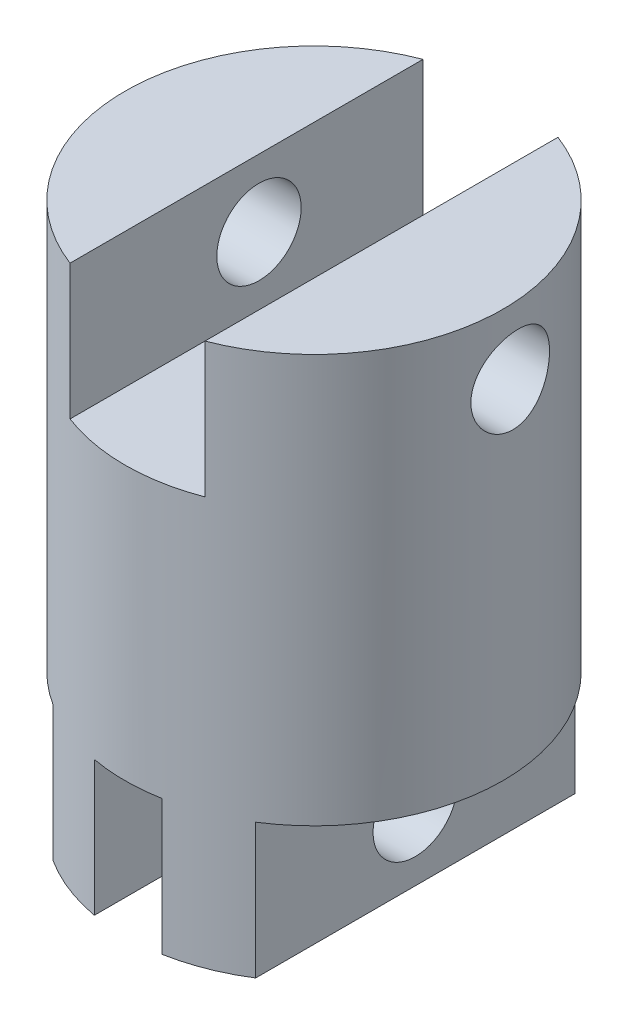
ISO-10303-21;
HEADER;
FILE_DESCRIPTION(('STEP AP214'),'2;1');
FILE_NAME('part.step','',(''),(''),'','','');
FILE_SCHEMA(('AUTOMOTIVE_DESIGN { 1 0 10303 214 1 1 1 1 }'));
ENDSEC;
DATA;
#1=APPLICATION_CONTEXT('core data for automotive mechanical design processes');
#2=APPLICATION_PROTOCOL_DEFINITION('international standard','automotive_design',2000,#1);
#3=PRODUCT_CONTEXT('',#1,'mechanical');
#4=PRODUCT('Part','Part','',(#3));
#5=PRODUCT_RELATED_PRODUCT_CATEGORY('part','',(#4));
#6=PRODUCT_DEFINITION_FORMATION('','',#4);
#7=PRODUCT_DEFINITION_CONTEXT('part definition',#1,'design');
#8=PRODUCT_DEFINITION('design','',#6,#7);
#9=PRODUCT_DEFINITION_SHAPE('','',#8);
#10=(LENGTH_UNIT() NAMED_UNIT(*) SI_UNIT(.MILLI.,.METRE.));
#11=(NAMED_UNIT(*) PLANE_ANGLE_UNIT() SI_UNIT($,.RADIAN.));
#12=(NAMED_UNIT(*) SI_UNIT($,.STERADIAN.) SOLID_ANGLE_UNIT());
#13=UNCERTAINTY_MEASURE_WITH_UNIT(LENGTH_MEASURE(1.E-05),#10,'distance_accuracy_value','');
#14=(GEOMETRIC_REPRESENTATION_CONTEXT(3) GLOBAL_UNCERTAINTY_ASSIGNED_CONTEXT((#13)) GLOBAL_UNIT_ASSIGNED_CONTEXT((#10,
#11,#12)) REPRESENTATION_CONTEXT('',''));
#15=CARTESIAN_POINT('',(0.,0.,0.));
#16=DIRECTION('',(0.,0.,1.));
#17=DIRECTION('',(1.,0.,0.));
#18=AXIS2_PLACEMENT_3D('',#15,#16,#17);
#19=CARTESIAN_POINT('',(0.,10.16,0.));
#20=DIRECTION('',(0.,-1.,0.));
#21=DIRECTION('',(0.,0.,-1.));
#22=AXIS2_PLACEMENT_3D('',#19,#20,#21);
#23=PLANE('',#22);
#24=CARTESIAN_POINT('',(0.,10.16,0.));
#25=DIRECTION('',(0.,-1.,0.));
#26=DIRECTION('',(0.,0.,-1.));
#27=AXIS2_PLACEMENT_3D('',#24,#25,#26);
#28=CIRCLE('',#27,2.54);
#29=CARTESIAN_POINT('',(2.54,10.16,0.));
#30=VERTEX_POINT('',#29);
#31=CARTESIAN_POINT('',(-2.54,10.16,0.));
#32=VERTEX_POINT('',#31);
#33=EDGE_CURVE('E57',#30,#32,#28,.T.);
#34=ORIENTED_EDGE('',*,*,#33,.F.);
#35=DIRECTION('',(0.,0.,1.));
#36=VECTOR('',#35,1.);
#37=CARTESIAN_POINT('',(2.54,10.16,13.9953769509792));
#38=LINE('',#37,#36);
#39=CARTESIAN_POINT('',(2.54,10.16,13.9953769509792));
#40=VERTEX_POINT('',#39);
#41=EDGE_CURVE('E148',#30,#40,#38,.T.);
#42=ORIENTED_EDGE('',*,*,#41,.T.);
#43=CARTESIAN_POINT('',(0.,10.16,0.));
#44=DIRECTION('',(0.,-1.,0.));
#45=DIRECTION('',(0.,0.,-1.));
#46=AXIS2_PLACEMENT_3D('',#43,#44,#45);
#47=CIRCLE('',#46,14.224);
#48=CARTESIAN_POINT('',(-2.54,10.16,13.9953769509792));
#49=VERTEX_POINT('',#48);
#50=EDGE_CURVE('E180',#40,#49,#47,.T.);
#51=ORIENTED_EDGE('',*,*,#50,.T.);
#52=DIRECTION('',(0.,0.,-1.));
#53=VECTOR('',#52,1.);
#54=CARTESIAN_POINT('',(-2.54,10.16,13.9953769509792));
#55=LINE('',#54,#53);
#56=EDGE_CURVE('E150',#49,#32,#55,.T.);
#57=ORIENTED_EDGE('',*,*,#56,.T.);
#58=EDGE_LOOP('',(#34,#42,#51,#57));
#59=FACE_BOUND('',#58,.T.);
#60=ADVANCED_FACE('F39',(#59),#23,.T.);
#61=CARTESIAN_POINT('',(0.,0.,0.));
#62=DIRECTION('',(0.,1.,0.));
#63=DIRECTION('',(0.,0.,1.));
#64=AXIS2_PLACEMENT_3D('',#61,#62,#63);
#65=PLANE('',#64);
#66=CARTESIAN_POINT('',(0.,0.,0.));
#67=DIRECTION('',(0.,1.,0.));
#68=DIRECTION('',(0.,0.,1.));
#69=AXIS2_PLACEMENT_3D('',#66,#67,#68);
#70=CIRCLE('',#69,14.224);
#71=CARTESIAN_POINT('',(7.62,0.,-12.0107358642175));
#72=VERTEX_POINT('',#71);
#73=CARTESIAN_POINT('',(2.54,0.,-13.9953769509792));
#74=VERTEX_POINT('',#73);
#75=EDGE_CURVE('E228',#72,#74,#70,.T.);
#76=ORIENTED_EDGE('',*,*,#75,.F.);
#77=DIRECTION('',(0.,0.,-1.));
#78=VECTOR('',#77,1.);
#79=CARTESIAN_POINT('',(7.62,0.,12.0107358642175));
#80=LINE('',#79,#78);
#81=CARTESIAN_POINT('',(7.62,0.,12.0107358642175));
#82=VERTEX_POINT('',#81);
#83=EDGE_CURVE('E462',#82,#72,#80,.T.);
#84=ORIENTED_EDGE('',*,*,#83,.F.);
#85=CARTESIAN_POINT('',(2.54,0.,13.9953769509792));
#86=VERTEX_POINT('',#85);
#87=EDGE_CURVE('E225',#86,#82,#70,.T.);
#88=ORIENTED_EDGE('',*,*,#87,.F.);
#89=DIRECTION('',(0.,0.,1.));
#90=VECTOR('',#89,1.);
#91=CARTESIAN_POINT('',(2.54,0.,13.9953769509792));
#92=LINE('',#91,#90);
#93=EDGE_CURVE('E176',#74,#86,#92,.T.);
#94=ORIENTED_EDGE('',*,*,#93,.F.);
#95=EDGE_LOOP('',(#76,#84,#88,#94));
#96=FACE_BOUND('',#95,.T.);
#97=ADVANCED_FACE('F321',(#96),#65,.F.);
#98=CARTESIAN_POINT('',(0.,40.894,0.));
#99=DIRECTION('',(0.,1.,0.));
#100=DIRECTION('',(0.,0.,1.));
#101=AXIS2_PLACEMENT_3D('',#98,#99,#100);
#102=PLANE('',#101);
#103=DIRECTION('',(0.,0.,-1.));
#104=VECTOR('',#103,1.);
#105=CARTESIAN_POINT('',(5.08,40.894,-13.285923979912));
#106=LINE('',#105,#104);
#107=CARTESIAN_POINT('',(5.08,40.894,13.285923979912));
#108=VERTEX_POINT('',#107);
#109=CARTESIAN_POINT('',(5.08,40.894,-13.285923979912));
#110=VERTEX_POINT('',#109);
#111=EDGE_CURVE('E195',#108,#110,#106,.T.);
#112=ORIENTED_EDGE('',*,*,#111,.F.);
#113=CARTESIAN_POINT('',(0.,40.894,0.));
#114=DIRECTION('',(0.,1.,0.));
#115=DIRECTION('',(0.,0.,1.));
#116=AXIS2_PLACEMENT_3D('',#113,#114,#115);
#117=CIRCLE('',#116,14.224);
#118=EDGE_CURVE('E11',#108,#110,#117,.T.);
#119=ORIENTED_EDGE('',*,*,#118,.T.);
#120=EDGE_LOOP('',(#112,#119));
#121=FACE_BOUND('',#120,.T.);
#122=ADVANCED_FACE('F318',(#121),#102,.T.);
#123=CARTESIAN_POINT('',(0.,40.894,0.));
#124=DIRECTION('',(0.,-1.,0.));
#125=DIRECTION('',(0.,0.,-1.));
#126=AXIS2_PLACEMENT_3D('',#123,#124,#125);
#127=CYLINDRICAL_SURFACE('',#126,14.224);
#128=CARTESIAN_POINT('',(-13.6163424476978,35.814,-4.11307602008802));
#129=CARTESIAN_POINT('',(-13.6163464933495,35.9879350319566,-4.11306992670584));
#130=CARTESIAN_POINT('',(-13.6207012560097,36.1619398649119,-4.09873000577014));
#131=CARTESIAN_POINT('',(-13.6376814645094,36.5049361335148,-4.0418642853371));
#132=CARTESIAN_POINT('',(-13.6503128734136,36.6739238626683,-3.99931816389405));
#133=CARTESIAN_POINT('',(-13.6825482114407,37.0018171755543,-3.8875956182581));
#134=CARTESIAN_POINT('',(-13.7021409077868,37.1607385185224,-3.81846208096061));
#135=CARTESIAN_POINT('',(-13.7464534742163,37.464690401487,-3.65571817194117));
#136=CARTESIAN_POINT('',(-13.7711735180498,37.6097204705069,-3.56210697071751));
#137=CARTESIAN_POINT('',(-13.824240361603,37.8858770872154,-3.35033418445522));
#138=CARTESIAN_POINT('',(-13.8526632977985,38.0165572294538,-3.23160970388735));
#139=CARTESIAN_POINT('',(-13.9101855998359,38.2564369352111,-2.97426856472494));
#140=CARTESIAN_POINT('',(-13.9392850764497,38.3656329529807,-2.83564862909394));
#141=CARTESIAN_POINT('',(-13.9965686122876,38.562327946645,-2.53806485718074));
#142=CARTESIAN_POINT('',(-14.0247073807823,38.6491686037583,-2.3786561130963));
#143=CARTESIAN_POINT('',(-14.0769627448023,38.7946242058183,-2.0468201507846));
#144=CARTESIAN_POINT('',(-14.1010796258335,38.8532411548687,-1.87439385791106));
#145=CARTESIAN_POINT('',(-14.1432686636008,38.9397315999161,-1.52347291043426));
#146=CARTESIAN_POINT('',(-14.1614092641535,38.9679622495235,-1.34507475053602));
#147=CARTESIAN_POINT('',(-14.1909623897953,38.9937547756175,-0.985531523676964));
#148=CARTESIAN_POINT('',(-14.2023761483574,38.991322276511,-0.804386966563939));
#149=CARTESIAN_POINT('',(-14.2179653062774,38.9561437085153,-0.449773442348153));
#150=CARTESIAN_POINT('',(-14.2223299205258,38.9242275388267,-0.276229975171825));
#151=CARTESIAN_POINT('',(-14.2248725764363,38.8321054416451,0.0632180014334298));
#152=CARTESIAN_POINT('',(-14.223050791663,38.7719003078634,0.229122725041301));
#153=CARTESIAN_POINT('',(-14.2143435449891,38.6253911163474,0.547606213839148));
#154=CARTESIAN_POINT('',(-14.207488444832,38.5392453664967,0.700258770691743));
#155=CARTESIAN_POINT('',(-14.1902999607818,38.3431642944539,0.989213835118324));
#156=CARTESIAN_POINT('',(-14.1799662502137,38.2332267383284,1.12551480548964));
#157=CARTESIAN_POINT('',(-14.157470951252,37.9906604029071,1.3801511419533));
#158=CARTESIAN_POINT('',(-14.1452831546706,37.8577017319725,1.49816999759197));
#159=CARTESIAN_POINT('',(-14.121192063088,37.5739604630996,1.71042514435716));
#160=CARTESIAN_POINT('',(-14.1092887845153,37.4231768388907,1.80466006514492));
#161=CARTESIAN_POINT('',(-14.0875096151677,37.1063680590371,1.96750976689973));
#162=CARTESIAN_POINT('',(-14.0776542065242,36.9402109069447,2.03587085582092));
#163=CARTESIAN_POINT('',(-14.0616458914782,36.5985956397679,2.14366189945061));
#164=CARTESIAN_POINT('',(-14.0554927112565,36.4231382135822,2.18309399381349));
#165=CARTESIAN_POINT('',(-14.0478723710926,36.069549446712,2.2316058746665));
#166=CARTESIAN_POINT('',(-14.0463644662888,35.8914552042461,2.24094960668048));
#167=CARTESIAN_POINT('',(-14.0481483994063,35.5362403275426,2.22973836374366));
#168=CARTESIAN_POINT('',(-14.0514400520778,35.3591196559925,2.20918454275631));
#169=CARTESIAN_POINT('',(-14.0622822171874,35.0121964929364,2.13907080008077));
#170=CARTESIAN_POINT('',(-14.0698018492552,34.8423504416273,2.08972110043227));
#171=CARTESIAN_POINT('',(-14.0879506423554,34.513325173616,1.96363290046471));
#172=CARTESIAN_POINT('',(-14.0985800179637,34.3541466939207,1.88689251007483));
#173=CARTESIAN_POINT('',(-14.1214452420732,34.0494416529346,1.70739161860209));
#174=CARTESIAN_POINT('',(-14.1336943530067,33.9040469599664,1.60440897635785));
#175=CARTESIAN_POINT('',(-14.157793801623,33.6324638133882,1.37559136045164));
#176=CARTESIAN_POINT('',(-14.1696441166975,33.5062764472478,1.24975509375998));
#177=CARTESIAN_POINT('',(-14.1910224427971,33.2757573860532,0.977641763561387));
#178=CARTESIAN_POINT('',(-14.2005327079564,33.1715934961499,0.831220984583768));
#179=CARTESIAN_POINT('',(-14.2152276327244,32.9893477299338,0.522761394106219));
#180=CARTESIAN_POINT('',(-14.2204127014247,32.9112633873489,0.360724061289926));
#181=CARTESIAN_POINT('',(-14.2249359053719,32.7842557209876,0.0276712745096149));
#182=CARTESIAN_POINT('',(-14.2243412255017,32.7350043586767,-0.14321810013157));
#183=CARTESIAN_POINT('',(-14.2165957706335,32.6656955897076,-0.490664215536213));
#184=CARTESIAN_POINT('',(-14.2094456855096,32.6456351116502,-0.667220358056892));
#185=CARTESIAN_POINT('',(-14.1885799172968,32.6352276266175,-1.01826236191764));
#186=CARTESIAN_POINT('',(-14.174959625613,32.6444596416994,-1.19274170616162));
#187=CARTESIAN_POINT('',(-14.141744146279,32.6912105000451,-1.53727505151267));
#188=CARTESIAN_POINT('',(-14.1221486556033,32.7287307780584,-1.70732882770723));
#189=CARTESIAN_POINT('',(-14.0779537946186,32.8312404734396,-2.04006076174768));
#190=CARTESIAN_POINT('',(-14.0533081328417,32.8964904843329,-2.20265230317249));
#191=CARTESIAN_POINT('',(-14.0008681927008,33.0525135343595,-2.51453909755992));
#192=CARTESIAN_POINT('',(-13.9730734134006,33.1432906375504,-2.66383222835268));
#193=CARTESIAN_POINT('',(-13.9156541980413,33.3507755899329,-2.94933025977667));
#194=CARTESIAN_POINT('',(-13.8860004160196,33.4681314302752,-3.08505871719465));
#195=CARTESIAN_POINT('',(-13.828095747917,33.724204911788,-3.33503301391553));
#196=CARTESIAN_POINT('',(-13.7998452096893,33.8629278150817,-3.44927354589455));
#197=CARTESIAN_POINT('',(-13.7470641678874,34.1595614172533,-3.65399959382471));
#198=CARTESIAN_POINT('',(-13.7225712418819,34.3176406644855,-3.74425102969636));
#199=CARTESIAN_POINT('',(-13.6800919910017,34.6475347757128,-3.8966096308186));
#200=CARTESIAN_POINT('',(-13.6620992266002,34.8193358386597,-3.95874466569694));
#201=CARTESIAN_POINT('',(-13.63787777829,35.1285302145908,-4.04126295275682));
#202=CARTESIAN_POINT('',(-13.6298496510107,35.2640869409034,-4.06813523028456));
#203=CARTESIAN_POINT('',(-13.6190806037134,35.5377479121654,-4.10404342599839));
#204=CARTESIAN_POINT('',(-13.6163392344352,35.6758519396424,-4.11308085976248));
#205=CARTESIAN_POINT('',(-13.6163424476978,35.814,-4.11307602008802));
#206=B_SPLINE_CURVE_WITH_KNOTS('',3,(#128,#129,#130,#131,#132,#133,#134,#135,#136,#137,#138,
#139,#140,#141,#142,#143,#144,#145,#146,#147,#148,#149,#150,#151,#152,#153,#154,#155,#156,#157,
#158,#159,#160,#161,#162,#163,#164,#165,#166,#167,#168,#169,#170,#171,#172,#173,#174,#175,#176,
#177,#178,#179,#180,#181,#182,#183,#184,#185,#186,#187,#188,#189,#190,#191,#192,#193,#194,#195,
#196,#197,#198,#199,#200,#201,#202,#203,#204,#205),.UNSPECIFIED.,.T.,.F.,(4,2,2,2,2,2,2,2,2,2,2,
2,2,2,2,2,2,2,2,2,2,2,2,2,2,2,2,2,2,2,2,2,2,2,2,2,2,2,4),(0.,0.521292414316557,1.04296081708785,
1.56379124709196,2.084639329342,2.61870932242577,3.1528673848531,3.70131003100702,
4.24971372770369,4.79159875885824,5.33338439586698,5.86036992801959,6.38734067527686,
6.91115849954563,7.43502552908346,7.96713736897425,8.49927986010553,9.03651256444963,
9.57370552983112,10.1061730294661,10.6386199778627,11.1672276279472,11.6958717611977,
12.2291488280213,12.7624560764039,13.2996909825271,13.8368750694073,14.3678223653898,
14.8987137922532,15.4220102383416,15.9453332272339,16.4736869186285,17.0021247745935,
17.5451842275619,18.0883776356926,18.6366915011972,19.1844606683088,19.598532840324,
20.012569823598),.UNSPECIFIED.);
#207=CARTESIAN_POINT('',(-13.6163424476978,35.814,-4.11307602008802));
#208=VERTEX_POINT('',#207);
#209=EDGE_CURVE('E261',#208,#208,#206,.T.);
#210=ORIENTED_EDGE('',*,*,#209,.T.);
#211=EDGE_LOOP('',(#210));
#212=FACE_BOUND('',#211,.T.);
#213=CARTESIAN_POINT('',(13.6163424476978,35.814,-4.11307602008802));
#214=CARTESIAN_POINT('',(13.6163464933495,35.6400649680434,-4.11306992670584));
#215=CARTESIAN_POINT('',(13.6207012560097,35.4660601350881,-4.09873000577014));
#216=CARTESIAN_POINT('',(13.6376814645094,35.1230638664852,-4.0418642853371));
#217=CARTESIAN_POINT('',(13.6503128734136,34.9540761373317,-3.99931816389405));
#218=CARTESIAN_POINT('',(13.6825482114407,34.6261828244457,-3.8875956182581));
#219=CARTESIAN_POINT('',(13.7021409077868,34.4672614814776,-3.81846208096061));
#220=CARTESIAN_POINT('',(13.7464534742163,34.163309598513,-3.65571817194117));
#221=CARTESIAN_POINT('',(13.7711735180498,34.0182795294931,-3.56210697071751));
#222=CARTESIAN_POINT('',(13.824240361603,33.7421229127846,-3.35033418445522));
#223=CARTESIAN_POINT('',(13.8526632977985,33.6114427705462,-3.23160970388735));
#224=CARTESIAN_POINT('',(13.9101855998359,33.3715630647889,-2.97426856472494));
#225=CARTESIAN_POINT('',(13.9392850764497,33.2623670470193,-2.83564862909394));
#226=CARTESIAN_POINT('',(13.9965686122876,33.065672053355,-2.53806485718074));
#227=CARTESIAN_POINT('',(14.0247073807823,32.9788313962417,-2.3786561130963));
#228=CARTESIAN_POINT('',(14.0769627448023,32.8333757941817,-2.0468201507846));
#229=CARTESIAN_POINT('',(14.1010796258335,32.7747588451313,-1.87439385791106));
#230=CARTESIAN_POINT('',(14.1432686636008,32.6882684000839,-1.52347291043426));
#231=CARTESIAN_POINT('',(14.1614092641535,32.6600377504765,-1.34507475053602));
#232=CARTESIAN_POINT('',(14.1909623897953,32.6342452243825,-0.985531523676964));
#233=CARTESIAN_POINT('',(14.2023761483574,32.636677723489,-0.804386966563939));
#234=CARTESIAN_POINT('',(14.2179653062774,32.6718562914847,-0.449773442348153));
#235=CARTESIAN_POINT('',(14.2223299205258,32.7037724611733,-0.276229975171825));
#236=CARTESIAN_POINT('',(14.2248725764363,32.7958945583549,0.0632180014334298));
#237=CARTESIAN_POINT('',(14.223050791663,32.8560996921366,0.229122725041301));
#238=CARTESIAN_POINT('',(14.2143435449891,33.0026088836526,0.547606213839148));
#239=CARTESIAN_POINT('',(14.207488444832,33.0887546335033,0.700258770691743));
#240=CARTESIAN_POINT('',(14.1902999607818,33.2848357055461,0.989213835118324));
#241=CARTESIAN_POINT('',(14.1799662502137,33.3947732616716,1.12551480548964));
#242=CARTESIAN_POINT('',(14.157470951252,33.6373395970929,1.3801511419533));
#243=CARTESIAN_POINT('',(14.1452831546706,33.7702982680275,1.49816999759197));
#244=CARTESIAN_POINT('',(14.121192063088,34.0540395369004,1.71042514435716));
#245=CARTESIAN_POINT('',(14.1092887845153,34.2048231611093,1.80466006514492));
#246=CARTESIAN_POINT('',(14.0875096151677,34.5216319409629,1.96750976689973));
#247=CARTESIAN_POINT('',(14.0776542065242,34.6877890930553,2.03587085582092));
#248=CARTESIAN_POINT('',(14.0616458914782,35.0294043602321,2.14366189945061));
#249=CARTESIAN_POINT('',(14.0554927112565,35.2048617864178,2.18309399381349));
#250=CARTESIAN_POINT('',(14.0478723710926,35.558450553288,2.2316058746665));
#251=CARTESIAN_POINT('',(14.0463644662888,35.7365447957539,2.24094960668048));
#252=CARTESIAN_POINT('',(14.0481483994063,36.0917596724574,2.22973836374366));
#253=CARTESIAN_POINT('',(14.0514400520778,36.2688803440075,2.20918454275631));
#254=CARTESIAN_POINT('',(14.0622822171874,36.6158035070636,2.13907080008077));
#255=CARTESIAN_POINT('',(14.0698018492552,36.7856495583727,2.08972110043227));
#256=CARTESIAN_POINT('',(14.0879506423554,37.114674826384,1.96363290046471));
#257=CARTESIAN_POINT('',(14.0985800179637,37.2738533060792,1.88689251007483));
#258=CARTESIAN_POINT('',(14.1214452420732,37.5785583470654,1.70739161860209));
#259=CARTESIAN_POINT('',(14.1336943530067,37.7239530400336,1.60440897635785));
#260=CARTESIAN_POINT('',(14.157793801623,37.9955361866118,1.37559136045164));
#261=CARTESIAN_POINT('',(14.1696441166975,38.1217235527522,1.24975509375998));
#262=CARTESIAN_POINT('',(14.1910224427971,38.3522426139468,0.977641763561388));
#263=CARTESIAN_POINT('',(14.2005327079564,38.4564065038501,0.831220984583771));
#264=CARTESIAN_POINT('',(14.2152276327244,38.6386522700662,0.522761394106221));
#265=CARTESIAN_POINT('',(14.2204127014247,38.7167366126511,0.360724061289927));
#266=CARTESIAN_POINT('',(14.2249359053719,38.8437442790124,0.0276712745096142));
#267=CARTESIAN_POINT('',(14.2243412255017,38.8929956413233,-0.143218100131571));
#268=CARTESIAN_POINT('',(14.2165957706335,38.9623044102924,-0.490664215536214));
#269=CARTESIAN_POINT('',(14.2094456855096,38.9823648883498,-0.667220358056892));
#270=CARTESIAN_POINT('',(14.1885799172968,38.9927723733825,-1.01826236191764));
#271=CARTESIAN_POINT('',(14.174959625613,38.9835403583005,-1.19274170616162));
#272=CARTESIAN_POINT('',(14.141744146279,38.9367894999549,-1.53727505151267));
#273=CARTESIAN_POINT('',(14.1221486556033,38.8992692219416,-1.70732882770723));
#274=CARTESIAN_POINT('',(14.0779537946186,38.7967595265604,-2.04006076174768));
#275=CARTESIAN_POINT('',(14.0533081328417,38.7315095156671,-2.20265230317249));
#276=CARTESIAN_POINT('',(14.0008681927008,38.5754864656405,-2.51453909755992));
#277=CARTESIAN_POINT('',(13.9730734134006,38.4847093624496,-2.66383222835268));
#278=CARTESIAN_POINT('',(13.9156541980413,38.2772244100671,-2.94933025977667));
#279=CARTESIAN_POINT('',(13.8860004160196,38.1598685697248,-3.08505871719466));
#280=CARTESIAN_POINT('',(13.828095747917,37.903795088212,-3.33503301391553));
#281=CARTESIAN_POINT('',(13.7998452096893,37.7650721849183,-3.44927354589455));
#282=CARTESIAN_POINT('',(13.7470641678874,37.4684385827467,-3.65399959382471));
#283=CARTESIAN_POINT('',(13.7225712418819,37.3103593355145,-3.74425102969636));
#284=CARTESIAN_POINT('',(13.6800919910017,36.9804652242872,-3.8966096308186));
#285=CARTESIAN_POINT('',(13.6620992266002,36.8086641613403,-3.95874466569694));
#286=CARTESIAN_POINT('',(13.63787777829,36.4994697854092,-4.04126295275682));
#287=CARTESIAN_POINT('',(13.6298496510107,36.3639130590966,-4.06813523028456));
#288=CARTESIAN_POINT('',(13.6190806037134,36.0902520878346,-4.10404342599839));
#289=CARTESIAN_POINT('',(13.6163392344352,35.9521480603576,-4.11308085976248));
#290=CARTESIAN_POINT('',(13.6163424476978,35.814,-4.11307602008802));
#291=B_SPLINE_CURVE_WITH_KNOTS('',3,(#213,#214,#215,#216,#217,#218,#219,#220,#221,#222,#223,
#224,#225,#226,#227,#228,#229,#230,#231,#232,#233,#234,#235,#236,#237,#238,#239,#240,#241,#242,
#243,#244,#245,#246,#247,#248,#249,#250,#251,#252,#253,#254,#255,#256,#257,#258,#259,#260,#261,
#262,#263,#264,#265,#266,#267,#268,#269,#270,#271,#272,#273,#274,#275,#276,#277,#278,#279,#280,
#281,#282,#283,#284,#285,#286,#287,#288,#289,#290),.UNSPECIFIED.,.T.,.F.,(4,2,2,2,2,2,2,2,2,2,2,
2,2,2,2,2,2,2,2,2,2,2,2,2,2,2,2,2,2,2,2,2,2,2,2,2,2,2,4),(0.,0.521292414316557,1.04296081708785,
1.56379124709196,2.084639329342,2.61870932242577,3.1528673848531,3.70131003100702,
4.24971372770369,4.79159875885824,5.33338439586698,5.86036992801959,6.38734067527686,
6.91115849954563,7.43502552908346,7.96713736897425,8.49927986010553,9.03651256444963,
9.57370552983112,10.1061730294661,10.6386199778627,11.1672276279472,11.6958717611977,
12.2291488280213,12.7624560764039,13.2996909825271,13.8368750694073,14.3678223653898,
14.8987137922532,15.4220102383416,15.9453332272339,16.4736869186285,17.0021247745935,
17.5451842275619,18.0883776356926,18.6366915011972,19.1844606683088,19.598532840324,
20.012569823598),.UNSPECIFIED.);
#292=CARTESIAN_POINT('',(13.6163424476978,35.814,-4.11307602008802));
#293=VERTEX_POINT('',#292);
#294=EDGE_CURVE('E253',#293,#293,#291,.T.);
#295=ORIENTED_EDGE('',*,*,#294,.T.);
#296=EDGE_LOOP('',(#295));
#297=FACE_BOUND('',#296,.T.);
#298=CARTESIAN_POINT('',(0.,10.16,0.));
#299=DIRECTION('',(0.,-1.,0.));
#300=DIRECTION('',(0.,0.,-1.));
#301=AXIS2_PLACEMENT_3D('',#298,#299,#300);
#302=CIRCLE('',#301,14.224);
#303=CARTESIAN_POINT('',(7.62,10.16,-12.0107358642175));
#304=VERTEX_POINT('',#303);
#305=CARTESIAN_POINT('',(7.62,10.16,12.0107358642175));
#306=VERTEX_POINT('',#305);
#307=EDGE_CURVE('E419',#304,#306,#302,.T.);
#308=ORIENTED_EDGE('',*,*,#307,.F.);
#309=DIRECTION('',(0.,-1.,0.));
#310=VECTOR('',#309,1.);
#311=CARTESIAN_POINT('',(7.62,10.16,-12.0107358642175));
#312=LINE('',#311,#310);
#313=EDGE_CURVE('E458',#304,#72,#312,.T.);
#314=ORIENTED_EDGE('',*,*,#313,.T.);
#315=ORIENTED_EDGE('',*,*,#75,.T.);
#316=DIRECTION('',(0.,-1.,0.));
#317=VECTOR('',#316,1.);
#318=CARTESIAN_POINT('',(2.54,10.16,-13.9953769509792));
#319=LINE('',#318,#317);
#320=CARTESIAN_POINT('',(2.54,10.16,-13.9953769509792));
#321=VERTEX_POINT('',#320);
#322=EDGE_CURVE('E184',#321,#74,#319,.T.);
#323=ORIENTED_EDGE('',*,*,#322,.F.);
#324=CARTESIAN_POINT('',(0.,10.16,0.));
#325=DIRECTION('',(0.,-1.,0.));
#326=DIRECTION('',(0.,0.,-1.));
#327=AXIS2_PLACEMENT_3D('',#324,#325,#326);
#328=CIRCLE('',#327,14.224);
#329=CARTESIAN_POINT('',(-2.54,10.16,-13.9953769509792));
#330=VERTEX_POINT('',#329);
#331=EDGE_CURVE('E162',#330,#321,#328,.T.);
#332=ORIENTED_EDGE('',*,*,#331,.F.);
#333=DIRECTION('',(0.,-1.,0.));
#334=VECTOR('',#333,1.);
#335=CARTESIAN_POINT('',(-2.54,10.16,-13.9953769509792));
#336=LINE('',#335,#334);
#337=CARTESIAN_POINT('',(-2.54,0.,-13.9953769509792));
#338=VERTEX_POINT('',#337);
#339=EDGE_CURVE('E168',#330,#338,#336,.T.);
#340=ORIENTED_EDGE('',*,*,#339,.T.);
#341=CARTESIAN_POINT('',(-7.62,0.,-12.0107358642175));
#342=VERTEX_POINT('',#341);
#343=EDGE_CURVE('E437',#338,#342,#70,.T.);
#344=ORIENTED_EDGE('',*,*,#343,.T.);
#345=DIRECTION('',(0.,-1.,0.));
#346=VECTOR('',#345,1.);
#347=CARTESIAN_POINT('',(-7.62,10.16,-12.0107358642175));
#348=LINE('',#347,#346);
#349=CARTESIAN_POINT('',(-7.62,10.16,-12.0107358642175));
#350=VERTEX_POINT('',#349);
#351=EDGE_CURVE('E470',#350,#342,#348,.T.);
#352=ORIENTED_EDGE('',*,*,#351,.F.);
#353=CARTESIAN_POINT('',(0.,10.16,0.));
#354=DIRECTION('',(0.,-1.,0.));
#355=DIRECTION('',(0.,0.,-1.));
#356=AXIS2_PLACEMENT_3D('',#353,#354,#355);
#357=CIRCLE('',#356,14.224);
#358=CARTESIAN_POINT('',(-7.62,10.16,12.0107358642175));
#359=VERTEX_POINT('',#358);
#360=EDGE_CURVE('E478',#359,#350,#357,.T.);
#361=ORIENTED_EDGE('',*,*,#360,.F.);
#362=DIRECTION('',(0.,-1.,0.));
#363=VECTOR('',#362,1.);
#364=CARTESIAN_POINT('',(-7.62,10.16,12.0107358642175));
#365=LINE('',#364,#363);
#366=CARTESIAN_POINT('',(-7.62,0.,12.0107358642175));
#367=VERTEX_POINT('',#366);
#368=EDGE_CURVE('E177',#359,#367,#365,.T.);
#369=ORIENTED_EDGE('',*,*,#368,.T.);
#370=CARTESIAN_POINT('',(-2.54,0.,13.9953769509792));
#371=VERTEX_POINT('',#370);
#372=EDGE_CURVE('E215',#367,#371,#70,.T.);
#373=ORIENTED_EDGE('',*,*,#372,.T.);
#374=DIRECTION('',(0.,-1.,0.));
#375=VECTOR('',#374,1.);
#376=CARTESIAN_POINT('',(-2.54,10.16,13.9953769509792));
#377=LINE('',#376,#375);
#378=EDGE_CURVE('E65',#49,#371,#377,.T.);
#379=ORIENTED_EDGE('',*,*,#378,.F.);
#380=ORIENTED_EDGE('',*,*,#50,.F.);
#381=DIRECTION('',(0.,-1.,0.));
#382=VECTOR('',#381,1.);
#383=CARTESIAN_POINT('',(2.54,10.16,13.9953769509792));
#384=LINE('',#383,#382);
#385=EDGE_CURVE('E159',#40,#86,#384,.T.);
#386=ORIENTED_EDGE('',*,*,#385,.T.);
#387=ORIENTED_EDGE('',*,*,#87,.T.);
#388=DIRECTION('',(0.,-1.,0.));
#389=VECTOR('',#388,1.);
#390=CARTESIAN_POINT('',(7.62,10.16,12.0107358642175));
#391=LINE('',#390,#389);
#392=EDGE_CURVE('E455',#306,#82,#391,.T.);
#393=ORIENTED_EDGE('',*,*,#392,.F.);
#394=EDGE_LOOP('',(#308,#314,#315,#323,#332,#340,#344,#352,#361,#369,#373,#379,#380,#386,#387,#393));
#395=FACE_BOUND('',#394,.T.);
#396=CARTESIAN_POINT('',(0.,30.734,0.));
#397=DIRECTION('',(0.,1.,0.));
#398=DIRECTION('',(0.,0.,1.));
#399=AXIS2_PLACEMENT_3D('',#396,#397,#398);
#400=CIRCLE('',#399,14.224);
#401=CARTESIAN_POINT('',(5.08,30.734,-13.285923979912));
#402=VERTEX_POINT('',#401);
#403=CARTESIAN_POINT('',(-5.08,30.734,-13.285923979912));
#404=VERTEX_POINT('',#403);
#405=EDGE_CURVE('E190',#402,#404,#400,.T.);
#406=ORIENTED_EDGE('',*,*,#405,.F.);
#407=DIRECTION('',(0.,1.,0.));
#408=VECTOR('',#407,1.);
#409=CARTESIAN_POINT('',(5.08,30.734,-13.285923979912));
#410=LINE('',#409,#408);
#411=EDGE_CURVE('E211',#402,#110,#410,.T.);
#412=ORIENTED_EDGE('',*,*,#411,.T.);
#413=ORIENTED_EDGE('',*,*,#118,.F.);
#414=DIRECTION('',(0.,1.,0.));
#415=VECTOR('',#414,1.);
#416=CARTESIAN_POINT('',(5.08,30.734,13.285923979912));
#417=LINE('',#416,#415);
#418=CARTESIAN_POINT('',(5.08,30.734,13.285923979912));
#419=VERTEX_POINT('',#418);
#420=EDGE_CURVE('E216',#419,#108,#417,.T.);
#421=ORIENTED_EDGE('',*,*,#420,.F.);
#422=CARTESIAN_POINT('',(0.,30.734,0.));
#423=DIRECTION('',(0.,1.,0.));
#424=DIRECTION('',(0.,0.,1.));
#425=AXIS2_PLACEMENT_3D('',#422,#423,#424);
#426=CIRCLE('',#425,14.224);
#427=CARTESIAN_POINT('',(-5.08,30.734,13.285923979912));
#428=VERTEX_POINT('',#427);
#429=EDGE_CURVE('E199',#428,#419,#426,.T.);
#430=ORIENTED_EDGE('',*,*,#429,.F.);
#431=DIRECTION('',(0.,1.,0.));
#432=VECTOR('',#431,1.);
#433=CARTESIAN_POINT('',(-5.08,30.734,13.285923979912));
#434=LINE('',#433,#432);
#435=CARTESIAN_POINT('',(-5.08,40.894,13.285923979912));
#436=VERTEX_POINT('',#435);
#437=EDGE_CURVE('E219',#428,#436,#434,.T.);
#438=ORIENTED_EDGE('',*,*,#437,.T.);
#439=CARTESIAN_POINT('',(-5.08,40.894,-13.285923979912));
#440=VERTEX_POINT('',#439);
#441=EDGE_CURVE('E50',#440,#436,#117,.T.);
#442=ORIENTED_EDGE('',*,*,#441,.F.);
#443=DIRECTION('',(0.,1.,0.));
#444=VECTOR('',#443,1.);
#445=CARTESIAN_POINT('',(-5.08,30.734,-13.285923979912));
#446=LINE('',#445,#444);
#447=EDGE_CURVE('E206',#404,#440,#446,.T.);
#448=ORIENTED_EDGE('',*,*,#447,.F.);
#449=EDGE_LOOP('',(#406,#412,#413,#421,#430,#438,#442,#448));
#450=FACE_BOUND('',#449,.T.);
#451=ADVANCED_FACE('F41',(#212,#297,#395,#450),#127,.T.);
#452=DIRECTION('',(0.,0.,1.));
#453=VECTOR('',#452,1.);
#454=CARTESIAN_POINT('',(-5.08,40.894,-13.285923979912));
#455=LINE('',#454,#453);
#456=EDGE_CURVE('E183',#440,#436,#455,.T.);
#457=ORIENTED_EDGE('',*,*,#456,.F.);
#458=ORIENTED_EDGE('',*,*,#441,.T.);
#459=EDGE_LOOP('',(#457,#458));
#460=FACE_BOUND('',#459,.T.);
#461=ADVANCED_FACE('F315',(#460),#102,.T.);
#462=ORIENTED_EDGE('',*,*,#372,.F.);
#463=DIRECTION('',(0.,0.,1.));
#464=VECTOR('',#463,1.);
#465=CARTESIAN_POINT('',(-7.62,0.,12.0107358642175));
#466=LINE('',#465,#464);
#467=EDGE_CURVE('E445',#342,#367,#466,.T.);
#468=ORIENTED_EDGE('',*,*,#467,.F.);
#469=ORIENTED_EDGE('',*,*,#343,.F.);
#470=DIRECTION('',(0.,0.,-1.));
#471=VECTOR('',#470,1.);
#472=CARTESIAN_POINT('',(-2.54,0.,13.9953769509792));
#473=LINE('',#472,#471);
#474=EDGE_CURVE('E173',#371,#338,#473,.T.);
#475=ORIENTED_EDGE('',*,*,#474,.F.);
#476=EDGE_LOOP('',(#462,#468,#469,#475));
#477=FACE_BOUND('',#476,.T.);
#478=ADVANCED_FACE('F310',(#477),#65,.F.);
#479=CARTESIAN_POINT('',(5.08,30.734,-13.285923979912));
#480=DIRECTION('',(1.,0.,0.));
#481=DIRECTION('',(0.,0.,-1.));
#482=AXIS2_PLACEMENT_3D('',#479,#480,#481);
#483=PLANE('',#482);
#484=CARTESIAN_POINT('',(5.08,35.814,-0.938076020088026));
#485=DIRECTION('',(1.,0.,0.));
#486=DIRECTION('',(0.,0.,-1.));
#487=AXIS2_PLACEMENT_3D('',#484,#485,#486);
#488=CIRCLE('',#487,3.175);
#489=CARTESIAN_POINT('',(5.08,35.814,-4.11307602008802));
#490=VERTEX_POINT('',#489);
#491=EDGE_CURVE('E249',#490,#490,#488,.T.);
#492=ORIENTED_EDGE('',*,*,#491,.T.);
#493=EDGE_LOOP('',(#492));
#494=FACE_BOUND('',#493,.T.);
#495=ORIENTED_EDGE('',*,*,#111,.T.);
#496=ORIENTED_EDGE('',*,*,#411,.F.);
#497=DIRECTION('',(0.,0.,-1.));
#498=VECTOR('',#497,1.);
#499=CARTESIAN_POINT('',(5.08,30.734,-13.285923979912));
#500=LINE('',#499,#498);
#501=EDGE_CURVE('E202',#419,#402,#500,.T.);
#502=ORIENTED_EDGE('',*,*,#501,.F.);
#503=ORIENTED_EDGE('',*,*,#420,.T.);
#504=EDGE_LOOP('',(#495,#496,#502,#503));
#505=FACE_BOUND('',#504,.T.);
#506=ADVANCED_FACE('F307',(#494,#505),#483,.F.);
#507=CARTESIAN_POINT('',(-5.08,30.734,-13.285923979912));
#508=DIRECTION('',(-1.,0.,0.));
#509=DIRECTION('',(0.,0.,1.));
#510=AXIS2_PLACEMENT_3D('',#507,#508,#509);
#511=PLANE('',#510);
#512=CARTESIAN_POINT('',(-5.08,35.814,-0.938076020088026));
#513=DIRECTION('',(-1.,0.,0.));
#514=DIRECTION('',(0.,0.,1.));
#515=AXIS2_PLACEMENT_3D('',#512,#513,#514);
#516=CIRCLE('',#515,3.175);
#517=CARTESIAN_POINT('',(-5.08,35.814,2.23692397991197));
#518=VERTEX_POINT('',#517);
#519=EDGE_CURVE('E44',#518,#518,#516,.T.);
#520=ORIENTED_EDGE('',*,*,#519,.T.);
#521=EDGE_LOOP('',(#520));
#522=FACE_BOUND('',#521,.T.);
#523=ORIENTED_EDGE('',*,*,#456,.T.);
#524=ORIENTED_EDGE('',*,*,#437,.F.);
#525=DIRECTION('',(0.,0.,1.));
#526=VECTOR('',#525,1.);
#527=CARTESIAN_POINT('',(-5.08,30.734,-13.285923979912));
#528=LINE('',#527,#526);
#529=EDGE_CURVE('E194',#404,#428,#528,.T.);
#530=ORIENTED_EDGE('',*,*,#529,.F.);
#531=ORIENTED_EDGE('',*,*,#447,.T.);
#532=EDGE_LOOP('',(#523,#524,#530,#531));
#533=FACE_BOUND('',#532,.T.);
#534=ADVANCED_FACE('F305',(#522,#533),#511,.F.);
#535=CARTESIAN_POINT('',(0.,30.734,0.));
#536=DIRECTION('',(0.,1.,0.));
#537=DIRECTION('',(0.,0.,1.));
#538=AXIS2_PLACEMENT_3D('',#535,#536,#537);
#539=PLANE('',#538);
#540=CARTESIAN_POINT('',(0.,30.734,0.));
#541=DIRECTION('',(0.,1.,0.));
#542=DIRECTION('',(0.,0.,1.));
#543=AXIS2_PLACEMENT_3D('',#540,#541,#542);
#544=CIRCLE('',#543,2.54);
#545=CARTESIAN_POINT('',(0.,30.734,2.54));
#546=VERTEX_POINT('',#545);
#547=EDGE_CURVE('E142',#546,#546,#544,.T.);
#548=ORIENTED_EDGE('',*,*,#547,.F.);
#549=EDGE_LOOP('',(#548));
#550=FACE_BOUND('',#549,.T.);
#551=ORIENTED_EDGE('',*,*,#405,.T.);
#552=ORIENTED_EDGE('',*,*,#529,.T.);
#553=ORIENTED_EDGE('',*,*,#429,.T.);
#554=ORIENTED_EDGE('',*,*,#501,.T.);
#555=EDGE_LOOP('',(#551,#552,#553,#554));
#556=FACE_BOUND('',#555,.T.);
#557=ADVANCED_FACE('F298',(#550,#556),#539,.T.);
#558=CARTESIAN_POINT('',(2.54,10.16,13.9953769509792));
#559=DIRECTION('',(1.,0.,0.));
#560=DIRECTION('',(0.,0.,-1.));
#561=AXIS2_PLACEMENT_3D('',#558,#559,#560);
#562=PLANE('',#561);
#563=CARTESIAN_POINT('',(2.54,5.08,0.));
#564=DIRECTION('',(1.,0.,0.));
#565=DIRECTION('',(0.,0.,-1.));
#566=AXIS2_PLACEMENT_3D('',#563,#564,#565);
#567=CIRCLE('',#566,3.175);
#568=CARTESIAN_POINT('',(2.54,5.08,-3.175));
#569=VERTEX_POINT('',#568);
#570=EDGE_CURVE('E242',#569,#569,#567,.T.);
#571=ORIENTED_EDGE('',*,*,#570,.T.);
#572=EDGE_LOOP('',(#571));
#573=FACE_BOUND('',#572,.T.);
#574=ORIENTED_EDGE('',*,*,#93,.T.);
#575=ORIENTED_EDGE('',*,*,#385,.F.);
#576=ORIENTED_EDGE('',*,*,#41,.F.);
#577=EDGE_CURVE('E156',#321,#30,#38,.T.);
#578=ORIENTED_EDGE('',*,*,#577,.F.);
#579=ORIENTED_EDGE('',*,*,#322,.T.);
#580=EDGE_LOOP('',(#574,#575,#576,#578,#579));
#581=FACE_BOUND('',#580,.T.);
#582=ADVANCED_FACE('F155',(#573,#581),#562,.F.);
#583=CARTESIAN_POINT('',(-2.54,10.16,13.9953769509792));
#584=DIRECTION('',(-1.,0.,0.));
#585=DIRECTION('',(0.,0.,1.));
#586=AXIS2_PLACEMENT_3D('',#583,#584,#585);
#587=PLANE('',#586);
#588=CARTESIAN_POINT('',(-2.54,5.08,0.));
#589=DIRECTION('',(-1.,0.,0.));
#590=DIRECTION('',(0.,0.,1.));
#591=AXIS2_PLACEMENT_3D('',#588,#589,#590);
#592=CIRCLE('',#591,3.175);
#593=CARTESIAN_POINT('',(-2.54,5.08,3.175));
#594=VERTEX_POINT('',#593);
#595=EDGE_CURVE('E236',#594,#594,#592,.T.);
#596=ORIENTED_EDGE('',*,*,#595,.T.);
#597=EDGE_LOOP('',(#596));
#598=FACE_BOUND('',#597,.T.);
#599=ORIENTED_EDGE('',*,*,#474,.T.);
#600=ORIENTED_EDGE('',*,*,#339,.F.);
#601=EDGE_CURVE('E450',#32,#330,#55,.T.);
#602=ORIENTED_EDGE('',*,*,#601,.F.);
#603=ORIENTED_EDGE('',*,*,#56,.F.);
#604=ORIENTED_EDGE('',*,*,#378,.T.);
#605=EDGE_LOOP('',(#599,#600,#602,#603,#604));
#606=FACE_BOUND('',#605,.T.);
#607=ADVANCED_FACE('F295',(#598,#606),#587,.F.);
#608=EDGE_CURVE('E135',#32,#30,#28,.T.);
#609=ORIENTED_EDGE('',*,*,#608,.F.);
#610=ORIENTED_EDGE('',*,*,#601,.T.);
#611=ORIENTED_EDGE('',*,*,#331,.T.);
#612=ORIENTED_EDGE('',*,*,#577,.T.);
#613=EDGE_LOOP('',(#609,#610,#611,#612));
#614=FACE_BOUND('',#613,.T.);
#615=ADVANCED_FACE('F164',(#614),#23,.T.);
#616=CARTESIAN_POINT('',(-7.62,10.16,12.0107358642175));
#617=DIRECTION('',(1.,0.,0.));
#618=DIRECTION('',(0.,0.,-1.));
#619=AXIS2_PLACEMENT_3D('',#616,#617,#618);
#620=PLANE('',#619);
#621=CARTESIAN_POINT('',(-7.62,5.08,0.));
#622=DIRECTION('',(1.,0.,0.));
#623=DIRECTION('',(0.,0.,-1.));
#624=AXIS2_PLACEMENT_3D('',#621,#622,#623);
#625=CIRCLE('',#624,3.175);
#626=CARTESIAN_POINT('',(-7.62,5.08,-3.175));
#627=VERTEX_POINT('',#626);
#628=EDGE_CURVE('E231',#627,#627,#625,.T.);
#629=ORIENTED_EDGE('',*,*,#628,.T.);
#630=EDGE_LOOP('',(#629));
#631=FACE_BOUND('',#630,.T.);
#632=ORIENTED_EDGE('',*,*,#467,.T.);
#633=ORIENTED_EDGE('',*,*,#368,.F.);
#634=DIRECTION('',(0.,0.,1.));
#635=VECTOR('',#634,1.);
#636=CARTESIAN_POINT('',(-7.62,10.16,12.0107358642175));
#637=LINE('',#636,#635);
#638=EDGE_CURVE('E473',#350,#359,#637,.T.);
#639=ORIENTED_EDGE('',*,*,#638,.F.);
#640=ORIENTED_EDGE('',*,*,#351,.T.);
#641=EDGE_LOOP('',(#632,#633,#639,#640));
#642=FACE_BOUND('',#641,.T.);
#643=ADVANCED_FACE('F284',(#631,#642),#620,.F.);
#644=CARTESIAN_POINT('',(0.,10.16,0.));
#645=DIRECTION('',(0.,-1.,0.));
#646=DIRECTION('',(0.,0.,-1.));
#647=AXIS2_PLACEMENT_3D('',#644,#645,#646);
#648=PLANE('',#647);
#649=ORIENTED_EDGE('',*,*,#360,.T.);
#650=ORIENTED_EDGE('',*,*,#638,.T.);
#651=EDGE_LOOP('',(#649,#650));
#652=FACE_BOUND('',#651,.T.);
#653=ADVANCED_FACE('F280',(#652),#648,.T.);
#654=CARTESIAN_POINT('',(7.62,10.16,12.0107358642175));
#655=DIRECTION('',(-1.,0.,0.));
#656=DIRECTION('',(0.,0.,1.));
#657=AXIS2_PLACEMENT_3D('',#654,#655,#656);
#658=PLANE('',#657);
#659=CARTESIAN_POINT('',(7.62,5.08,0.));
#660=DIRECTION('',(-1.,0.,0.));
#661=DIRECTION('',(0.,0.,1.));
#662=AXIS2_PLACEMENT_3D('',#659,#660,#661);
#663=CIRCLE('',#662,3.175);
#664=CARTESIAN_POINT('',(7.62,5.08,3.175));
#665=VERTEX_POINT('',#664);
#666=EDGE_CURVE('E152',#665,#665,#663,.T.);
#667=ORIENTED_EDGE('',*,*,#666,.T.);
#668=EDGE_LOOP('',(#667));
#669=FACE_BOUND('',#668,.T.);
#670=ORIENTED_EDGE('',*,*,#83,.T.);
#671=ORIENTED_EDGE('',*,*,#313,.F.);
#672=DIRECTION('',(0.,0.,-1.));
#673=VECTOR('',#672,1.);
#674=CARTESIAN_POINT('',(7.62,10.16,12.0107358642175));
#675=LINE('',#674,#673);
#676=EDGE_CURVE('E459',#306,#304,#675,.T.);
#677=ORIENTED_EDGE('',*,*,#676,.F.);
#678=ORIENTED_EDGE('',*,*,#392,.T.);
#679=EDGE_LOOP('',(#670,#671,#677,#678));
#680=FACE_BOUND('',#679,.T.);
#681=ADVANCED_FACE('F283',(#669,#680),#658,.F.);
#682=CARTESIAN_POINT('',(0.,10.16,0.));
#683=DIRECTION('',(0.,-1.,0.));
#684=DIRECTION('',(0.,0.,-1.));
#685=AXIS2_PLACEMENT_3D('',#682,#683,#684);
#686=PLANE('',#685);
#687=ORIENTED_EDGE('',*,*,#307,.T.);
#688=ORIENTED_EDGE('',*,*,#676,.T.);
#689=EDGE_LOOP('',(#687,#688));
#690=FACE_BOUND('',#689,.T.);
#691=ADVANCED_FACE('F278',(#690),#686,.T.);
#692=CARTESIAN_POINT('',(-14.224,5.08,0.));
#693=DIRECTION('',(1.,0.,0.));
#694=DIRECTION('',(0.,0.,-1.));
#695=AXIS2_PLACEMENT_3D('',#692,#693,#694);
#696=CYLINDRICAL_SURFACE('',#695,3.175);
#697=ORIENTED_EDGE('',*,*,#666,.F.);
#698=EDGE_LOOP('',(#697));
#699=FACE_BOUND('',#698,.T.);
#700=ORIENTED_EDGE('',*,*,#570,.F.);
#701=EDGE_LOOP('',(#700));
#702=FACE_BOUND('',#701,.T.);
#703=ADVANCED_FACE('F274',(#699,#702),#696,.F.);
#704=ORIENTED_EDGE('',*,*,#628,.F.);
#705=EDGE_LOOP('',(#704));
#706=FACE_BOUND('',#705,.T.);
#707=ORIENTED_EDGE('',*,*,#595,.F.);
#708=EDGE_LOOP('',(#707));
#709=FACE_BOUND('',#708,.T.);
#710=ADVANCED_FACE('F272',(#706,#709),#696,.F.);
#711=CARTESIAN_POINT('',(-14.224,35.814,-0.938076020088026));
#712=DIRECTION('',(1.,0.,0.));
#713=DIRECTION('',(0.,0.,-1.));
#714=AXIS2_PLACEMENT_3D('',#711,#712,#713);
#715=CYLINDRICAL_SURFACE('',#714,3.175);
#716=ORIENTED_EDGE('',*,*,#519,.F.);
#717=EDGE_LOOP('',(#716));
#718=FACE_BOUND('',#717,.T.);
#719=ORIENTED_EDGE('',*,*,#209,.F.);
#720=EDGE_LOOP('',(#719));
#721=FACE_BOUND('',#720,.T.);
#722=ADVANCED_FACE('F266',(#718,#721),#715,.F.);
#723=ORIENTED_EDGE('',*,*,#491,.F.);
#724=EDGE_LOOP('',(#723));
#725=FACE_BOUND('',#724,.T.);
#726=ORIENTED_EDGE('',*,*,#294,.F.);
#727=EDGE_LOOP('',(#726));
#728=FACE_BOUND('',#727,.T.);
#729=ADVANCED_FACE('F271',(#725,#728),#715,.F.);
#730=CARTESIAN_POINT('',(0.,0.,0.));
#731=DIRECTION('',(0.,1.,0.));
#732=DIRECTION('',(0.,0.,1.));
#733=AXIS2_PLACEMENT_3D('',#730,#731,#732);
#734=CYLINDRICAL_SURFACE('',#733,2.54);
#735=ORIENTED_EDGE('',*,*,#33,.T.);
#736=ORIENTED_EDGE('',*,*,#608,.T.);
#737=EDGE_LOOP('',(#735,#736));
#738=FACE_BOUND('',#737,.T.);
#739=ORIENTED_EDGE('',*,*,#547,.T.);
#740=EDGE_LOOP('',(#739));
#741=FACE_BOUND('',#740,.T.);
#742=ADVANCED_FACE('F136',(#738,#741),#734,.F.);
#743=CLOSED_SHELL('',(#60,#97,#122,#451,#461,#478,#506,#534,#557,#582,#607,#615,#643,#653,#681,
#691,#703,#710,#722,#729,#742));
#744=MANIFOLD_SOLID_BREP('B2',#743);
#745=ADVANCED_BREP_SHAPE_REPRESENTATION('',(#18,#744),#14);
#746=SHAPE_DEFINITION_REPRESENTATION(#9,#745);
ENDSEC;
END-ISO-10303-21;
